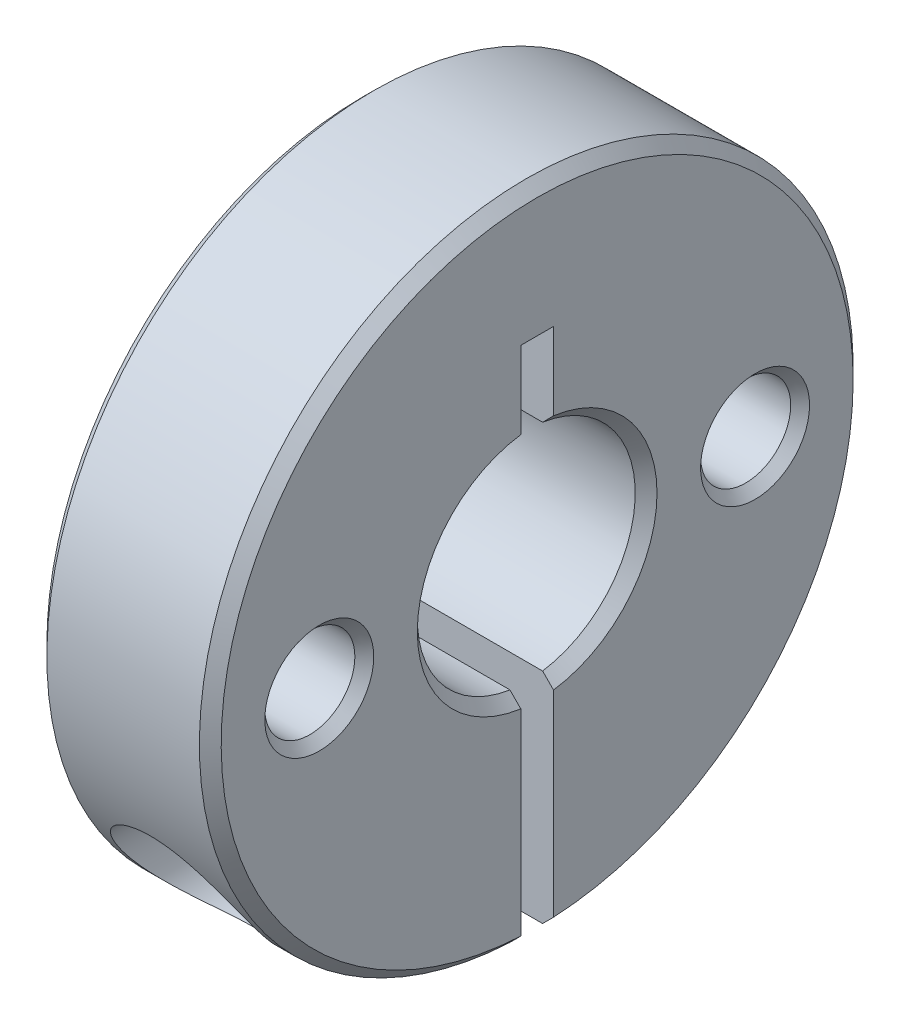
ISO-10303-21;
HEADER;
FILE_DESCRIPTION(('STEP AP214'),'2;1');
FILE_NAME('part.step','',(''),(''),'','','');
FILE_SCHEMA(('AUTOMOTIVE_DESIGN { 1 0 10303 214 1 1 1 1 }'));
ENDSEC;
DATA;
#1=APPLICATION_CONTEXT('core data for automotive mechanical design processes');
#2=APPLICATION_PROTOCOL_DEFINITION('international standard','automotive_design',2000,#1);
#3=PRODUCT_CONTEXT('',#1,'mechanical');
#4=PRODUCT('Part','Part','',(#3));
#5=PRODUCT_RELATED_PRODUCT_CATEGORY('part','',(#4));
#6=PRODUCT_DEFINITION_FORMATION('','',#4);
#7=PRODUCT_DEFINITION_CONTEXT('part definition',#1,'design');
#8=PRODUCT_DEFINITION('design','',#6,#7);
#9=PRODUCT_DEFINITION_SHAPE('','',#8);
#10=(LENGTH_UNIT() NAMED_UNIT(*) SI_UNIT(.MILLI.,.METRE.));
#11=(NAMED_UNIT(*) PLANE_ANGLE_UNIT() SI_UNIT($,.RADIAN.));
#12=(NAMED_UNIT(*) SI_UNIT($,.STERADIAN.) SOLID_ANGLE_UNIT());
#13=UNCERTAINTY_MEASURE_WITH_UNIT(LENGTH_MEASURE(1.E-05),#10,'distance_accuracy_value','');
#14=(GEOMETRIC_REPRESENTATION_CONTEXT(3) GLOBAL_UNCERTAINTY_ASSIGNED_CONTEXT((#13)) GLOBAL_UNIT_ASSIGNED_CONTEXT((#10,
#11,#12)) REPRESENTATION_CONTEXT('',''));
#15=CARTESIAN_POINT('',(0.,0.,0.));
#16=DIRECTION('',(0.,0.,1.));
#17=DIRECTION('',(1.,0.,0.));
#18=AXIS2_PLACEMENT_3D('',#15,#16,#17);
#19=CARTESIAN_POINT('',(3.567,0.,10.));
#20=DIRECTION('',(1.,0.,0.));
#21=DIRECTION('',(0.,0.,-1.));
#22=AXIS2_PLACEMENT_3D('',#19,#20,#21);
#23=CONICAL_SURFACE('',#22,2.067,0.785398163397448);
#24=CARTESIAN_POINT('',(3.567,0.,10.));
#25=DIRECTION('',(1.,0.,0.));
#26=DIRECTION('',(0.,0.,-1.));
#27=AXIS2_PLACEMENT_3D('',#24,#25,#26);
#28=CIRCLE('',#27,2.067);
#29=CARTESIAN_POINT('',(3.567,0.,7.933));
#30=VERTEX_POINT('',#29);
#31=EDGE_CURVE('E11',#30,#30,#28,.T.);
#32=ORIENTED_EDGE('',*,*,#31,.F.);
#33=EDGE_LOOP('',(#32));
#34=FACE_BOUND('',#33,.T.);
#35=CARTESIAN_POINT('',(4.,0.,10.));
#36=DIRECTION('',(1.,0.,0.));
#37=DIRECTION('',(0.,0.,-1.));
#38=AXIS2_PLACEMENT_3D('',#35,#36,#37);
#39=CIRCLE('',#38,2.5);
#40=CARTESIAN_POINT('',(4.,0.,7.5));
#41=VERTEX_POINT('',#40);
#42=EDGE_CURVE('E168',#41,#41,#39,.T.);
#43=ORIENTED_EDGE('',*,*,#42,.T.);
#44=EDGE_LOOP('',(#43));
#45=FACE_BOUND('',#44,.T.);
#46=ADVANCED_FACE('F17',(#34,#45),#23,.F.);
#47=CARTESIAN_POINT('',(4.,0.,10.));
#48=DIRECTION('',(1.,0.,0.));
#49=DIRECTION('',(0.,0.,-1.));
#50=AXIS2_PLACEMENT_3D('',#47,#48,#49);
#51=CYLINDRICAL_SURFACE('',#50,2.067);
#52=CARTESIAN_POINT('',(-3.567,0.,10.));
#53=DIRECTION('',(1.,0.,0.));
#54=DIRECTION('',(0.,0.,-1.));
#55=AXIS2_PLACEMENT_3D('',#52,#53,#54);
#56=CIRCLE('',#55,2.067);
#57=CARTESIAN_POINT('',(-3.567,0.,7.933));
#58=VERTEX_POINT('',#57);
#59=EDGE_CURVE('E28',#58,#58,#56,.T.);
#60=ORIENTED_EDGE('',*,*,#59,.F.);
#61=EDGE_LOOP('',(#60));
#62=FACE_BOUND('',#61,.T.);
#63=ORIENTED_EDGE('',*,*,#31,.T.);
#64=EDGE_LOOP('',(#63));
#65=FACE_BOUND('',#64,.T.);
#66=ADVANCED_FACE('F376',(#62,#65),#51,.F.);
#67=CARTESIAN_POINT('',(-4.,0.,10.));
#68=DIRECTION('',(-1.,0.,0.));
#69=DIRECTION('',(0.,0.,1.));
#70=AXIS2_PLACEMENT_3D('',#67,#68,#69);
#71=CONICAL_SURFACE('',#70,2.5,0.785398163397449);
#72=CARTESIAN_POINT('',(-4.,0.,10.));
#73=DIRECTION('',(1.,0.,0.));
#74=DIRECTION('',(0.,0.,-1.));
#75=AXIS2_PLACEMENT_3D('',#72,#73,#74);
#76=CIRCLE('',#75,2.5);
#77=CARTESIAN_POINT('',(-4.,0.,7.5));
#78=VERTEX_POINT('',#77);
#79=EDGE_CURVE('E222',#78,#78,#76,.T.);
#80=ORIENTED_EDGE('',*,*,#79,.F.);
#81=EDGE_LOOP('',(#80));
#82=FACE_BOUND('',#81,.T.);
#83=ORIENTED_EDGE('',*,*,#59,.T.);
#84=EDGE_LOOP('',(#83));
#85=FACE_BOUND('',#84,.T.);
#86=ADVANCED_FACE('F374',(#82,#85),#71,.F.);
#87=CARTESIAN_POINT('',(3.567,0.,-10.));
#88=DIRECTION('',(1.,0.,0.));
#89=DIRECTION('',(0.,0.,-1.));
#90=AXIS2_PLACEMENT_3D('',#87,#88,#89);
#91=CONICAL_SURFACE('',#90,2.067,0.785398163397448);
#92=CARTESIAN_POINT('',(3.567,0.,-10.));
#93=DIRECTION('',(1.,0.,0.));
#94=DIRECTION('',(0.,0.,-1.));
#95=AXIS2_PLACEMENT_3D('',#92,#93,#94);
#96=CIRCLE('',#95,2.067);
#97=CARTESIAN_POINT('',(3.567,0.,-12.067));
#98=VERTEX_POINT('',#97);
#99=EDGE_CURVE('E240',#98,#98,#96,.T.);
#100=ORIENTED_EDGE('',*,*,#99,.F.);
#101=EDGE_LOOP('',(#100));
#102=FACE_BOUND('',#101,.T.);
#103=CARTESIAN_POINT('',(4.,0.,-10.));
#104=DIRECTION('',(1.,0.,0.));
#105=DIRECTION('',(0.,0.,-1.));
#106=AXIS2_PLACEMENT_3D('',#103,#104,#105);
#107=CIRCLE('',#106,2.5);
#108=CARTESIAN_POINT('',(4.,0.,-12.5));
#109=VERTEX_POINT('',#108);
#110=EDGE_CURVE('E250',#109,#109,#107,.T.);
#111=ORIENTED_EDGE('',*,*,#110,.T.);
#112=EDGE_LOOP('',(#111));
#113=FACE_BOUND('',#112,.T.);
#114=ADVANCED_FACE('F372',(#102,#113),#91,.F.);
#115=CARTESIAN_POINT('',(4.,0.,-10.));
#116=DIRECTION('',(1.,0.,0.));
#117=DIRECTION('',(0.,0.,-1.));
#118=AXIS2_PLACEMENT_3D('',#115,#116,#117);
#119=CYLINDRICAL_SURFACE('',#118,2.067);
#120=CARTESIAN_POINT('',(-3.567,0.,-10.));
#121=DIRECTION('',(1.,0.,0.));
#122=DIRECTION('',(0.,0.,-1.));
#123=AXIS2_PLACEMENT_3D('',#120,#121,#122);
#124=CIRCLE('',#123,2.067);
#125=CARTESIAN_POINT('',(-3.567,0.,-12.067));
#126=VERTEX_POINT('',#125);
#127=EDGE_CURVE('E244',#126,#126,#124,.T.);
#128=ORIENTED_EDGE('',*,*,#127,.F.);
#129=EDGE_LOOP('',(#128));
#130=FACE_BOUND('',#129,.T.);
#131=ORIENTED_EDGE('',*,*,#99,.T.);
#132=EDGE_LOOP('',(#131));
#133=FACE_BOUND('',#132,.T.);
#134=ADVANCED_FACE('F368',(#130,#133),#119,.F.);
#135=CARTESIAN_POINT('',(-4.,0.,-10.));
#136=DIRECTION('',(-1.,0.,0.));
#137=DIRECTION('',(0.,0.,1.));
#138=AXIS2_PLACEMENT_3D('',#135,#136,#137);
#139=CONICAL_SURFACE('',#138,2.5,0.785398163397449);
#140=CARTESIAN_POINT('',(-4.,0.,-10.));
#141=DIRECTION('',(1.,0.,0.));
#142=DIRECTION('',(0.,0.,-1.));
#143=AXIS2_PLACEMENT_3D('',#140,#141,#142);
#144=CIRCLE('',#143,2.5);
#145=CARTESIAN_POINT('',(-4.,0.,-12.5));
#146=VERTEX_POINT('',#145);
#147=EDGE_CURVE('E204',#146,#146,#144,.T.);
#148=ORIENTED_EDGE('',*,*,#147,.F.);
#149=EDGE_LOOP('',(#148));
#150=FACE_BOUND('',#149,.T.);
#151=ORIENTED_EDGE('',*,*,#127,.T.);
#152=EDGE_LOOP('',(#151));
#153=FACE_BOUND('',#152,.T.);
#154=ADVANCED_FACE('F362',(#150,#153),#139,.F.);
#155=CARTESIAN_POINT('',(0.,-9.,-14.25));
#156=DIRECTION('',(0.,0.,-1.));
#157=DIRECTION('',(-1.,0.,0.));
#158=AXIS2_PLACEMENT_3D('',#155,#156,#157);
#159=CYLINDRICAL_SURFACE('',#158,1.2295);
#160=CARTESIAN_POINT('',(0.,-9.,-1.0205));
#161=DIRECTION('',(0.,0.,-1.));
#162=DIRECTION('',(-1.,0.,0.));
#163=AXIS2_PLACEMENT_3D('',#160,#161,#162);
#164=CIRCLE('',#163,1.2295);
#165=CARTESIAN_POINT('',(-1.2295,-9.,-1.0205));
#166=VERTEX_POINT('',#165);
#167=EDGE_CURVE('E330',#166,#166,#164,.T.);
#168=ORIENTED_EDGE('',*,*,#167,.F.);
#169=EDGE_LOOP('',(#168));
#170=FACE_BOUND('',#169,.T.);
#171=CARTESIAN_POINT('',(-1.2295,-9.,-12.));
#172=CARTESIAN_POINT('',(-1.22949903687024,-8.91650532521457,-12.062618271753));
#173=CARTESIAN_POINT('',(-1.22099819046928,-8.83223382257045,-12.1244488755977));
#174=CARTESIAN_POINT('',(-1.18600433099134,-8.66475536955165,-12.2446990213997));
#175=CARTESIAN_POINT('',(-1.15948740922647,-8.58154998367935,-12.3031139184379));
#176=CARTESIAN_POINT('',(-1.09547810250136,-8.43753619960128,-12.4021721293139));
#177=CARTESIAN_POINT('',(-1.06168617518575,-8.37582913513614,-12.4438970563747));
#178=CARTESIAN_POINT('',(-0.982388149361399,-8.2572615155196,-12.5228867860049));
#179=CARTESIAN_POINT('',(-0.936891984675387,-8.20039690460824,-12.5601553317706));
#180=CARTESIAN_POINT('',(-0.833948852790094,-8.09349521648211,-12.6293083377118));
#181=CARTESIAN_POINT('',(-0.776402373528062,-8.04352113170197,-12.6611436843852));
#182=CARTESIAN_POINT('',(-0.650644983572041,-7.95392627721546,-12.7176205967301));
#183=CARTESIAN_POINT('',(-0.582444304408762,-7.91429567089304,-12.7422689997964));
#184=CARTESIAN_POINT('',(-0.44836979707426,-7.85316310736465,-12.7800207428912));
#185=CARTESIAN_POINT('',(-0.383653677975963,-7.82984324950397,-12.794294799492));
#186=CARTESIAN_POINT('',(-0.250172728815347,-7.79424742731836,-12.8160115352396));
#187=CARTESIAN_POINT('',(-0.18141185035928,-7.78196086863777,-12.8234607678343));
#188=CARTESIAN_POINT('',(-0.0509422249437208,-7.77002704223174,-12.8306943393349));
#189=CARTESIAN_POINT('',(0.0106007014016626,-7.76901794052606,-12.8313045666463));
#190=CARTESIAN_POINT('',(0.132941521525758,-7.77617521729976,-12.8269683625141));
#191=CARTESIAN_POINT('',(0.193739620506211,-7.78433900841663,-12.8220234979738));
#192=CARTESIAN_POINT('',(0.310872109045502,-7.8089928381838,-12.8070225725604));
#193=CARTESIAN_POINT('',(0.367287160147323,-7.8252068203924,-12.7971359044097));
#194=CARTESIAN_POINT('',(0.476350145090983,-7.86504057431043,-12.7726927359963));
#195=CARTESIAN_POINT('',(0.528997585108792,-7.88866131465439,-12.7581356249407));
#196=CARTESIAN_POINT('',(0.632016278504355,-7.94368181402839,-12.7239544224354));
#197=CARTESIAN_POINT('',(0.682133952078699,-7.97541725721484,-12.7041095166873));
#198=CARTESIAN_POINT('',(0.77618621627973,-8.04468797543866,-12.6603583140388));
#199=CARTESIAN_POINT('',(0.820118503035924,-8.0822254006764,-12.6364505111105));
#200=CARTESIAN_POINT('',(0.906018140401137,-8.16643904733157,-12.5822118634741));
#201=CARTESIAN_POINT('',(0.94717256610695,-8.2136700374815,-12.5514581004158));
#202=CARTESIAN_POINT('',(1.02096061781423,-8.3121750261861,-12.4864420698837));
#203=CARTESIAN_POINT('',(1.05358975380153,-8.36345113675074,-12.4521779667903));
#204=CARTESIAN_POINT('',(1.11488801883043,-8.47703390535586,-12.3751892302271));
#205=CARTESIAN_POINT('',(1.14210432004452,-8.5397987379352,-12.3319853130481));
#206=CARTESIAN_POINT('',(1.18549790807839,-8.66713829199465,-12.242825328428));
#207=CARTESIAN_POINT('',(1.20166930254605,-8.73171396044476,-12.1968678061625));
#208=CARTESIAN_POINT('',(1.22527442376572,-8.87236794509615,-12.0950337681932));
#209=CARTESIAN_POINT('',(1.23073952166908,-8.94852375482987,-12.0388056073471));
#210=CARTESIAN_POINT('',(1.22778928932068,-9.09961250437411,-11.9250166589663));
#211=CARTESIAN_POINT('',(1.21936047327974,-9.17454418470465,-11.8674546302239));
#212=CARTESIAN_POINT('',(1.18709208393158,-9.33118596184038,-11.7447899713193));
#213=CARTESIAN_POINT('',(1.16139294421812,-9.41251223751991,-11.6796790839334));
#214=CARTESIAN_POINT('',(1.09303019751645,-9.56945380353177,-11.551441535557));
#215=CARTESIAN_POINT('',(1.05037362113126,-9.64507144523952,-11.488314063926));
#216=CARTESIAN_POINT('',(0.959680542589986,-9.77153465014391,-11.3807886348741));
#217=CARTESIAN_POINT('',(0.91514483731411,-9.82407485819922,-11.3354251731674));
#218=CARTESIAN_POINT('',(0.815657670420337,-9.92263740225646,-11.2492456232473));
#219=CARTESIAN_POINT('',(0.760722905205075,-9.96866998253857,-11.2084224099016));
#220=CARTESIAN_POINT('',(0.654509779243567,-10.0423218070898,-11.1424247581654));
#221=CARTESIAN_POINT('',(0.605366290588804,-10.0717316767444,-11.1158210940528));
#222=CARTESIAN_POINT('',(0.501320158078037,-10.124156784142,-11.0680940085103));
#223=CARTESIAN_POINT('',(0.446424810136305,-10.1471799909114,-11.0469637597694));
#224=CARTESIAN_POINT('',(0.340725129856197,-10.1824473144091,-11.0144565953094));
#225=CARTESIAN_POINT('',(0.290606017701628,-10.1958091890354,-11.002075451562));
#226=CARTESIAN_POINT('',(0.188014455810648,-10.2161616751429,-10.9831797312959));
#227=CARTESIAN_POINT('',(0.135543500402809,-10.2231562737405,-10.9766614835285));
#228=CARTESIAN_POINT('',(0.0295713951120025,-10.2302939681324,-10.9700096357148));
#229=CARTESIAN_POINT('',(-0.0239322998106492,-10.2304171475501,-10.9698945949636));
#230=CARTESIAN_POINT('',(-0.130125610278265,-10.2237521947992,-10.9761063302888));
#231=CARTESIAN_POINT('',(-0.182815091231471,-10.2169629321335,-10.9824341600661));
#232=CARTESIAN_POINT('',(-0.283683036507581,-10.1973827390797,-11.0006159376238));
#233=CARTESIAN_POINT('',(-0.331958007643797,-10.184855021586,-11.0122273943435));
#234=CARTESIAN_POINT('',(-0.425408108859989,-10.1546059353925,-11.0401268559154));
#235=CARTESIAN_POINT('',(-0.470581869077565,-10.1368822895417,-11.0564169111314));
#236=CARTESIAN_POINT('',(-0.574423939622663,-10.0891003958,-11.1000659454654));
#237=CARTESIAN_POINT('',(-0.631357033987356,-10.0569366222527,-11.1292540804374));
#238=CARTESIAN_POINT('',(-0.737447784552465,-9.98586890768674,-11.1930653896078));
#239=CARTESIAN_POINT('',(-0.786589450970131,-9.94695144058999,-11.2276994574155));
#240=CARTESIAN_POINT('',(-0.891036737676859,-9.85099566066572,-11.3120781205852));
#241=CARTESIAN_POINT('',(-0.943521701200818,-9.79208207488264,-11.3631762947657));
#242=CARTESIAN_POINT('',(-1.03526798929581,-9.66773722675456,-11.4691567624378));
#243=CARTESIAN_POINT('',(-1.07451181950233,-9.60229748862503,-11.5240439476525));
#244=CARTESIAN_POINT('',(-1.14056712275481,-9.46546099453245,-11.6367114213212));
#245=CARTESIAN_POINT('',(-1.16713564480756,-9.39397655251296,-11.6945264172413));
#246=CARTESIAN_POINT('',(-1.2066362271238,-9.24780859282567,-11.8104485190191));
#247=CARTESIAN_POINT('',(-1.21960202229528,-9.17313346954843,-11.8685545414321));
#248=CARTESIAN_POINT('',(-1.22819901801466,-9.06523074882488,-11.950869222201));
#249=CARTESIAN_POINT('',(-1.22950037691181,-9.03267485903174,-11.975494925783));
#250=CARTESIAN_POINT('',(-1.2295,-9.,-12.));
#251=B_SPLINE_CURVE_WITH_KNOTS('',3,(#171,#172,#173,#174,#175,#176,#177,#178,#179,#180,#181,
#182,#183,#184,#185,#186,#187,#188,#189,#190,#191,#192,#193,#194,#195,#196,#197,#198,#199,#200,
#201,#202,#203,#204,#205,#206,#207,#208,#209,#210,#211,#212,#213,#214,#215,#216,#217,#218,#219,
#220,#221,#222,#223,#224,#225,#226,#227,#228,#229,#230,#231,#232,#233,#234,#235,#236,#237,#238,
#239,#240,#241,#242,#243,#244,#245,#246,#247,#248,#249,#250),.UNSPECIFIED.,.T.,.F.,(4,2,2,2,2,2,
2,2,2,2,2,2,2,2,2,2,2,2,2,2,2,2,2,2,2,2,2,2,2,2,2,2,2,2,2,2,2,2,2,4),(0.,0.312977816645716,
0.626371791781494,0.870785370583508,1.11499218694933,1.36130136988563,1.60737545294663,
1.81691758276531,2.02625829096273,2.21000049138097,2.39369087735298,2.57147708456851,
2.74928655185674,2.93617727831033,3.12313743281571,3.33169005112327,3.54035228743186,
3.78216691666489,4.02411045113288,4.30745379507872,4.59107232131544,4.91153154184312,
5.23185803737429,5.4784213197104,5.72459203489745,5.91335495448983,6.10188127272933,
6.26117920367922,6.42037731530846,6.58003682875482,6.73972245795633,6.89272154356409,
7.04578778255435,7.25943450550826,7.47351415819645,7.75403744143886,8.03492991765988,
8.32100921691981,8.60637734713558,8.72885828457552),.UNSPECIFIED.);
#252=CARTESIAN_POINT('',(-1.2295,-9.,-12.));
#253=VERTEX_POINT('',#252);
#254=EDGE_CURVE('E340',#253,#253,#251,.F.);
#255=ORIENTED_EDGE('',*,*,#254,.F.);
#256=EDGE_LOOP('',(#255));
#257=FACE_BOUND('',#256,.T.);
#258=ADVANCED_FACE('F356',(#170,#257),#159,.F.);
#259=CARTESIAN_POINT('',(0.,-9.,-0.75));
#260=DIRECTION('',(0.,0.,1.));
#261=DIRECTION('',(1.,0.,0.));
#262=AXIS2_PLACEMENT_3D('',#259,#260,#261);
#263=CONICAL_SURFACE('',#262,1.5,0.785398163397456);
#264=CARTESIAN_POINT('',(0.,-9.,-0.75));
#265=DIRECTION('',(0.,0.,-1.));
#266=DIRECTION('',(-1.,0.,0.));
#267=AXIS2_PLACEMENT_3D('',#264,#265,#266);
#268=CIRCLE('',#267,1.5);
#269=CARTESIAN_POINT('',(-1.5,-9.,-0.75));
#270=VERTEX_POINT('',#269);
#271=EDGE_CURVE('E310',#270,#270,#268,.T.);
#272=ORIENTED_EDGE('',*,*,#271,.F.);
#273=EDGE_LOOP('',(#272));
#274=FACE_BOUND('',#273,.T.);
#275=ORIENTED_EDGE('',*,*,#167,.T.);
#276=EDGE_LOOP('',(#275));
#277=FACE_BOUND('',#276,.T.);
#278=ADVANCED_FACE('F361',(#274,#277),#263,.F.);
#279=CARTESIAN_POINT('',(0.,-9.,15.));
#280=DIRECTION('',(0.,0.,1.));
#281=DIRECTION('',(1.,0.,0.));
#282=AXIS2_PLACEMENT_3D('',#279,#280,#281);
#283=CYLINDRICAL_SURFACE('',#282,3.);
#284=CARTESIAN_POINT('',(0.,-9.,5.));
#285=DIRECTION('',(0.,0.,1.));
#286=DIRECTION('',(1.,0.,0.));
#287=AXIS2_PLACEMENT_3D('',#284,#285,#286);
#288=CIRCLE('',#287,3.);
#289=CARTESIAN_POINT('',(3.,-9.,5.));
#290=VERTEX_POINT('',#289);
#291=EDGE_CURVE('E326',#290,#290,#288,.T.);
#292=ORIENTED_EDGE('',*,*,#291,.F.);
#293=EDGE_LOOP('',(#292));
#294=FACE_BOUND('',#293,.T.);
#295=CARTESIAN_POINT('',(3.,-9.,12.));
#296=CARTESIAN_POINT('',(3.0000000281716,-8.89761236658478,12.0767910518407));
#297=CARTESIAN_POINT('',(2.99475925357747,-8.79423482665152,12.1522714865818));
#298=CARTESIAN_POINT('',(2.97318304015255,-8.58635837613578,12.3000286081194));
#299=CARTESIAN_POINT('',(2.95684959366341,-8.48185967024123,12.3723058677516));
#300=CARTESIAN_POINT('',(2.91248078357458,-8.27276451387101,12.5130827860168));
#301=CARTESIAN_POINT('',(2.88444539051334,-8.16816806314991,12.5815824351385));
#302=CARTESIAN_POINT('',(2.81618127232349,-7.9602401958805,12.7141572656467));
#303=CARTESIAN_POINT('',(2.77595868565652,-7.85690816966203,12.7782346545404));
#304=CARTESIAN_POINT('',(2.66283888793594,-7.6089681862633,12.9279752502093));
#305=CARTESIAN_POINT('',(2.58332928100595,-7.46573091706655,13.0110631195871));
#306=CARTESIAN_POINT('',(2.39832368976567,-7.19014981059152,13.1653606242811));
#307=CARTESIAN_POINT('',(2.2928493967507,-7.05779700276993,13.2365800917805));
#308=CARTESIAN_POINT('',(2.05646546874585,-6.80898865451281,13.3662817162172));
#309=CARTESIAN_POINT('',(1.92542233820795,-6.69262226292782,13.4246934482085));
#310=CARTESIAN_POINT('',(1.64132842921988,-6.48261981755891,13.5273564939002));
#311=CARTESIAN_POINT('',(1.48828332953237,-6.38897791524079,13.5716114520222));
#312=CARTESIAN_POINT('',(1.1804951889875,-6.23720512454645,13.641980090626));
#313=CARTESIAN_POINT('',(1.02729950903098,-6.17654303486977,13.6694193149134));
#314=CARTESIAN_POINT('',(0.711495833980856,-6.08093219126733,13.7122223655172));
#315=CARTESIAN_POINT('',(0.548891532383554,-6.04597342000354,13.7275908962969));
#316=CARTESIAN_POINT('',(0.228738324941823,-6.00462525829323,13.7457247749398));
#317=CARTESIAN_POINT('',(0.071417333071448,-5.99674357475033,13.7491486050878));
#318=CARTESIAN_POINT('',(-0.242372321077991,-6.00569238676457,13.7452422965788));
#319=CARTESIAN_POINT('',(-0.398841113122292,-6.02251900801852,13.7379138438977));
#320=CARTESIAN_POINT('',(-0.704187401497253,-6.07974135372398,13.712683506812));
#321=CARTESIAN_POINT('',(-0.853141164816375,-6.11979884383196,13.6949333146547));
#322=CARTESIAN_POINT('',(-1.14174190334556,-6.22154040079625,13.6490120061103));
#323=CARTESIAN_POINT('',(-1.28138886403182,-6.28322450140118,13.6208408734614));
#324=CARTESIAN_POINT('',(-1.55003715631045,-6.42687636769338,13.553657034606));
#325=CARTESIAN_POINT('',(-1.67882679018881,-6.50915965499257,13.5144743967473));
#326=CARTESIAN_POINT('',(-1.92025669383705,-6.69015309415317,13.4257955162727));
#327=CARTESIAN_POINT('',(-2.03289450924844,-6.78886573763276,13.3762977090073));
#328=CARTESIAN_POINT('',(-2.24549454768574,-7.00453865254523,13.2646863141449));
#329=CARTESIAN_POINT('',(-2.34448350129256,-7.12218399128979,13.2020476318901));
#330=CARTESIAN_POINT('',(-2.52129418068924,-7.36723093319321,13.0668856385658));
#331=CARTESIAN_POINT('',(-2.59910912395928,-7.49463564579472,12.9943591713531));
#332=CARTESIAN_POINT('',(-2.74028616851803,-7.76838108440307,12.8327689166305));
#333=CARTESIAN_POINT('',(-2.80138831560887,-7.91533323887633,12.7427743038199));
#334=CARTESIAN_POINT('',(-2.89877473455527,-8.21166349041424,12.5538653262507));
#335=CARTESIAN_POINT('',(-2.93504448891103,-8.3610429543841,12.4549457819801));
#336=CARTESIAN_POINT('',(-2.98815299574943,-8.68173282264211,12.2340104619415));
#337=CARTESIAN_POINT('',(-3.00110724575922,-8.85285263476353,12.1107916373077));
#338=CARTESIAN_POINT('',(-2.99874327147509,-9.18950076395348,11.8573848450307));
#339=CARTESIAN_POINT('',(-2.98341811038934,-9.35502769897621,11.7271951750819));
#340=CARTESIAN_POINT('',(-2.92175090623679,-9.70794937361779,11.4375281038091));
#341=CARTESIAN_POINT('',(-2.87015346525393,-9.89365907750904,11.2771197227891));
#342=CARTESIAN_POINT('',(-2.73356234999849,-10.2507218337155,10.9535779263071));
#343=CARTESIAN_POINT('',(-2.64848379387107,-10.4220370426764,10.7904386017843));
#344=CARTESIAN_POINT('',(-2.4894845516896,-10.6776384099444,10.5359099526734));
#345=CARTESIAN_POINT('',(-2.42630471695768,-10.7678570129837,10.4436206890144));
#346=CARTESIAN_POINT('',(-2.2892490918834,-10.9420691702141,10.2609465629855));
#347=CARTESIAN_POINT('',(-2.21536816930779,-11.0260597080397,10.1705626383776));
#348=CARTESIAN_POINT('',(-2.05687652730042,-11.1867689568341,9.99352035195065));
#349=CARTESIAN_POINT('',(-1.97230198571086,-11.2635107291835,9.90685068983362));
#350=CARTESIAN_POINT('',(-1.79173671957351,-11.4089632039896,9.73898667649849));
#351=CARTESIAN_POINT('',(-1.69575961544526,-11.4776832975822,9.6577859707717));
#352=CARTESIAN_POINT('',(-1.49584349460759,-11.6030346161821,9.50677710957465));
#353=CARTESIAN_POINT('',(-1.3924030940932,-11.6600503351405,9.4366351675753));
#354=CARTESIAN_POINT('',(-1.17390349564229,-11.7634236987022,9.30745361292691));
#355=CARTESIAN_POINT('',(-1.05886187343007,-11.8097971272126,9.24839758241525));
#356=CARTESIAN_POINT('',(-0.837823280746388,-11.8825701473084,9.15464132366608));
#357=CARTESIAN_POINT('',(-0.733550427058158,-11.9110160070761,9.11751662450088));
#358=CARTESIAN_POINT('',(-0.51867475810223,-11.956856875139,9.05731883687037));
#359=CARTESIAN_POINT('',(-0.408078745744484,-11.9742635250906,9.03423094662695));
#360=CARTESIAN_POINT('',(-0.1825602661193,-11.9965945264265,9.00455960786743));
#361=CARTESIAN_POINT('',(-0.0676126349161518,-12.0014292778362,8.99809463457973));
#362=CARTESIAN_POINT('',(0.161700447047636,-11.9978329671069,9.00288899682817));
#363=CARTESIAN_POINT('',(0.276065873499413,-11.9894013555402,9.01414906644861));
#364=CARTESIAN_POINT('',(0.488134144694279,-11.9617445688353,9.05080662759414));
#365=CARTESIAN_POINT('',(0.586304285380237,-11.9437807771749,9.07454944413839));
#366=CARTESIAN_POINT('',(0.777256836163909,-11.8992236793557,9.13289789189033));
#367=CARTESIAN_POINT('',(0.870036794352186,-11.8726264816761,9.16750842150605));
#368=CARTESIAN_POINT('',(1.10008967509261,-11.7949548688011,9.26741303177506));
#369=CARTESIAN_POINT('',(1.23282126111613,-11.7385470820405,9.33898606754431));
#370=CARTESIAN_POINT('',(1.48257695471508,-11.6118373037573,9.49607563012608));
#371=CARTESIAN_POINT('',(1.59955279776914,-11.5414941804126,9.58163330026485));
#372=CARTESIAN_POINT('',(1.79168251725764,-11.4083135896568,9.73952405581402));
#373=CARTESIAN_POINT('',(1.870073723331,-11.3478378809344,9.8099846574017));
#374=CARTESIAN_POINT('',(2.01873568555686,-11.2213153656014,9.95446124256341));
#375=CARTESIAN_POINT('',(2.08900228233066,-11.1552657351001,10.0284790200188));
#376=CARTESIAN_POINT('',(2.22177455277774,-11.0181265402706,10.1789620606932));
#377=CARTESIAN_POINT('',(2.28427106615439,-10.9470311796041,10.2554300815066));
#378=CARTESIAN_POINT('',(2.40160294254063,-10.8003125162991,10.4098316436995));
#379=CARTESIAN_POINT('',(2.45643961675277,-10.7246899917893,10.4877649316585));
#380=CARTESIAN_POINT('',(2.56052530353253,-10.5662180534314,10.647448621986));
#381=CARTESIAN_POINT('',(2.60947437027293,-10.4832020001452,10.7292296702897));
#382=CARTESIAN_POINT('',(2.6991386785255,-10.3129788782135,10.8929547918378));
#383=CARTESIAN_POINT('',(2.73985061527458,-10.2257701447489,10.9748989172473));
#384=CARTESIAN_POINT('',(2.84914258768015,-9.95879124590553,11.2196420083053));
#385=CARTESIAN_POINT('',(2.90524738012766,-9.77310620844951,11.3819222604959));
#386=CARTESIAN_POINT('',(2.96172760108871,-9.48723477105997,11.6192734996374));
#387=CARTESIAN_POINT('',(2.97593482707689,-9.39154113851759,11.6967624917702));
#388=CARTESIAN_POINT('',(2.99507673555968,-9.197543690363,11.8499129665532));
#389=CARTESIAN_POINT('',(2.99999997269534,-9.0992368042459,11.9255720800924));
#390=CARTESIAN_POINT('',(3.,-9.,12.));
#391=B_SPLINE_CURVE_WITH_KNOTS('',3,(#295,#296,#297,#298,#299,#300,#301,#302,#303,#304,#305,
#306,#307,#308,#309,#310,#311,#312,#313,#314,#315,#316,#317,#318,#319,#320,#321,#322,#323,#324,
#325,#326,#327,#328,#329,#330,#331,#332,#333,#334,#335,#336,#337,#338,#339,#340,#341,#342,#343,
#344,#345,#346,#347,#348,#349,#350,#351,#352,#353,#354,#355,#356,#357,#358,#359,#360,#361,#362,
#363,#364,#365,#366,#367,#368,#369,#370,#371,#372,#373,#374,#375,#376,#377,#378,#379,#380,#381,
#382,#383,#384,#385,#386,#387,#388,#389,#390),.UNSPECIFIED.,.T.,.F.,(4,2,2,2,2,2,2,2,2,2,2,2,2,
2,2,2,2,2,2,2,2,2,2,2,2,2,2,2,2,2,2,2,2,2,2,2,2,2,2,2,2,2,2,2,2,2,2,4),(0.,0.383830399082823,
0.767591877068661,1.15135432124226,1.53492379186393,2.083534837616,2.63168911149913,
3.18278583058226,3.73374056476171,4.23226829983649,4.73060164087571,5.20098710607217,
5.6712988219229,6.13492897904277,6.59855985966696,7.06978057907242,7.54107282737556,
8.03705678431843,8.53319942973885,9.07955810931599,9.62623592868674,10.2576722683464,
10.8892635166315,11.638741228116,12.3901313964943,12.8207638220334,13.2516034666368,
13.6810226866713,14.1099340252435,14.5209675303584,14.9313874215148,15.2729027611168,
15.614057346228,15.9576367602748,16.3012304040691,16.6077886058588,16.9144851815557,
17.3947808246957,17.8765158269225,18.2406143106474,18.6048983762483,18.9696079108855,
19.3342549382512,19.7130721659788,20.0920410763345,20.8473568739945,21.218917692021,
21.5909362738251),.UNSPECIFIED.);
#392=CARTESIAN_POINT('',(3.,-9.,12.));
#393=VERTEX_POINT('',#392);
#394=EDGE_CURVE('E179',#393,#393,#391,.F.);
#395=ORIENTED_EDGE('',*,*,#394,.F.);
#396=EDGE_LOOP('',(#395));
#397=FACE_BOUND('',#396,.T.);
#398=ADVANCED_FACE('F694',(#294,#397),#283,.F.);
#399=CARTESIAN_POINT('',(0.,-10.7,5.));
#400=DIRECTION('',(0.,0.,1.));
#401=DIRECTION('',(1.,0.,0.));
#402=AXIS2_PLACEMENT_3D('',#399,#400,#401);
#403=PLANE('',#402);
#404=CARTESIAN_POINT('',(0.,-9.,5.));
#405=DIRECTION('',(0.,0.,1.));
#406=DIRECTION('',(1.,0.,0.));
#407=AXIS2_PLACEMENT_3D('',#404,#405,#406);
#408=CIRCLE('',#407,1.7);
#409=CARTESIAN_POINT('',(1.7,-9.,5.));
#410=VERTEX_POINT('',#409);
#411=EDGE_CURVE('E322',#410,#410,#408,.T.);
#412=ORIENTED_EDGE('',*,*,#411,.F.);
#413=EDGE_LOOP('',(#412));
#414=FACE_BOUND('',#413,.T.);
#415=ORIENTED_EDGE('',*,*,#291,.T.);
#416=EDGE_LOOP('',(#415));
#417=FACE_BOUND('',#416,.T.);
#418=ADVANCED_FACE('F423',(#414,#417),#403,.T.);
#419=CARTESIAN_POINT('',(0.,-9.,15.));
#420=DIRECTION('',(0.,0.,1.));
#421=DIRECTION('',(1.,0.,0.));
#422=AXIS2_PLACEMENT_3D('',#419,#420,#421);
#423=CYLINDRICAL_SURFACE('',#422,1.7);
#424=CARTESIAN_POINT('',(0.,-9.,0.75));
#425=DIRECTION('',(0.,0.,1.));
#426=DIRECTION('',(-1.,0.,0.));
#427=AXIS2_PLACEMENT_3D('',#424,#425,#426);
#428=CIRCLE('',#427,1.7);
#429=CARTESIAN_POINT('',(-1.7,-9.,0.75));
#430=VERTEX_POINT('',#429);
#431=EDGE_CURVE('E314',#430,#430,#428,.T.);
#432=ORIENTED_EDGE('',*,*,#431,.F.);
#433=EDGE_LOOP('',(#432));
#434=FACE_BOUND('',#433,.T.);
#435=ORIENTED_EDGE('',*,*,#411,.T.);
#436=EDGE_LOOP('',(#435));
#437=FACE_BOUND('',#436,.T.);
#438=ADVANCED_FACE('F364',(#434,#437),#423,.F.);
#439=CARTESIAN_POINT('',(4.,9.,-0.75));
#440=DIRECTION('',(0.,-1.,0.));
#441=DIRECTION('',(0.,0.,-1.));
#442=AXIS2_PLACEMENT_3D('',#439,#440,#441);
#443=PLANE('',#442);
#444=DIRECTION('',(0.,0.,1.));
#445=VECTOR('',#444,1.);
#446=CARTESIAN_POINT('',(-4.,9.,-0.75));
#447=LINE('',#446,#445);
#448=CARTESIAN_POINT('',(-4.,9.,-0.75));
#449=VERTEX_POINT('',#448);
#450=CARTESIAN_POINT('',(-4.,9.,0.75));
#451=VERTEX_POINT('',#450);
#452=EDGE_CURVE('E194',#449,#451,#447,.T.);
#453=ORIENTED_EDGE('',*,*,#452,.F.);
#454=DIRECTION('',(-1.,0.,0.));
#455=VECTOR('',#454,1.);
#456=CARTESIAN_POINT('',(4.,9.,-0.75));
#457=LINE('',#456,#455);
#458=CARTESIAN_POINT('',(4.,9.,-0.75));
#459=VERTEX_POINT('',#458);
#460=EDGE_CURVE('E41',#459,#449,#457,.T.);
#461=ORIENTED_EDGE('',*,*,#460,.F.);
#462=DIRECTION('',(0.,0.,1.));
#463=VECTOR('',#462,1.);
#464=CARTESIAN_POINT('',(4.,9.,-0.75));
#465=LINE('',#464,#463);
#466=CARTESIAN_POINT('',(4.,9.,0.75));
#467=VERTEX_POINT('',#466);
#468=EDGE_CURVE('E213',#459,#467,#465,.T.);
#469=ORIENTED_EDGE('',*,*,#468,.T.);
#470=DIRECTION('',(-1.,0.,0.));
#471=VECTOR('',#470,1.);
#472=CARTESIAN_POINT('',(4.,9.,0.75));
#473=LINE('',#472,#471);
#474=EDGE_CURVE('E51',#467,#451,#473,.T.);
#475=ORIENTED_EDGE('',*,*,#474,.T.);
#476=EDGE_LOOP('',(#453,#461,#469,#475));
#477=FACE_BOUND('',#476,.T.);
#478=ADVANCED_FACE('F412',(#477),#443,.T.);
#479=CARTESIAN_POINT('',(4.,9.,0.75));
#480=DIRECTION('',(0.,0.,-1.));
#481=DIRECTION('',(0.,-1.,0.));
#482=AXIS2_PLACEMENT_3D('',#479,#480,#481);
#483=PLANE('',#482);
#484=DIRECTION('',(0.,-1.,0.));
#485=VECTOR('',#484,1.);
#486=CARTESIAN_POINT('',(-4.,9.,0.75));
#487=LINE('',#486,#485);
#488=CARTESIAN_POINT('',(-4.,5.44862367942584,0.75));
#489=VERTEX_POINT('',#488);
#490=EDGE_CURVE('E198',#451,#489,#487,.T.);
#491=ORIENTED_EDGE('',*,*,#490,.F.);
#492=ORIENTED_EDGE('',*,*,#474,.F.);
#493=DIRECTION('',(0.,-1.,0.));
#494=VECTOR('',#493,1.);
#495=CARTESIAN_POINT('',(4.,9.,0.75));
#496=LINE('',#495,#494);
#497=CARTESIAN_POINT('',(4.,5.44862367942584,0.75));
#498=VERTEX_POINT('',#497);
#499=EDGE_CURVE('E210',#467,#498,#496,.T.);
#500=ORIENTED_EDGE('',*,*,#499,.T.);
#501=CARTESIAN_POINT('',(3.5,4.9434299833213,0.75));
#502=CARTESIAN_POINT('',(3.66657819671435,5.11191441344003,0.75));
#503=CARTESIAN_POINT('',(3.83325298492479,5.28030436855534,0.75));
#504=CARTESIAN_POINT('',(4.,5.44862367942584,0.75));
#505=B_SPLINE_CURVE_WITH_KNOTS('',3,(#501,#502,#503,#504),.UNSPECIFIED.,.F.,.F.,(4,4),
(0.0138521254088545,0.0145618807638747),.UNSPECIFIED.);
#506=CARTESIAN_POINT('',(3.5,4.9434299833213,0.75));
#507=VERTEX_POINT('',#506);
#508=EDGE_CURVE('E297',#507,#498,#505,.T.);
#509=ORIENTED_EDGE('',*,*,#508,.F.);
#510=DIRECTION('',(1.,0.,0.));
#511=VECTOR('',#510,1.);
#512=CARTESIAN_POINT('',(4.,4.9434299833213,0.75));
#513=LINE('',#512,#511);
#514=CARTESIAN_POINT('',(-3.5,4.9434299833213,0.75));
#515=VERTEX_POINT('',#514);
#516=EDGE_CURVE('E267',#515,#507,#513,.T.);
#517=ORIENTED_EDGE('',*,*,#516,.F.);
#518=CARTESIAN_POINT('',(-4.,5.44862367942584,0.75));
#519=CARTESIAN_POINT('',(-3.83325164976726,5.2803030208083,0.75));
#520=CARTESIAN_POINT('',(-3.6665767281134,5.11191292803318,0.75));
#521=CARTESIAN_POINT('',(-3.5,4.9434299833213,0.75));
#522=B_SPLINE_CURVE_WITH_KNOTS('',3,(#518,#519,#520,#521),.UNSPECIFIED.,.F.,.F.,(4,4),
(9.94358004317836E-07,0.000711598615025338),.UNSPECIFIED.);
#523=EDGE_CURVE('E239',#489,#515,#522,.T.);
#524=ORIENTED_EDGE('',*,*,#523,.F.);
#525=EDGE_LOOP('',(#491,#492,#500,#509,#517,#524));
#526=FACE_BOUND('',#525,.T.);
#527=ADVANCED_FACE('F408',(#526),#483,.T.);
#528=CARTESIAN_POINT('',(4.,-15.,-0.75));
#529=DIRECTION('',(0.,0.,1.));
#530=DIRECTION('',(1.,0.,0.));
#531=AXIS2_PLACEMENT_3D('',#528,#529,#530);
#532=PLANE('',#531);
#533=DIRECTION('',(-1.,0.,0.));
#534=VECTOR('',#533,1.);
#535=CARTESIAN_POINT('',(4.,4.9434299833213,-0.75));
#536=LINE('',#535,#534);
#537=CARTESIAN_POINT('',(3.5,4.9434299833213,-0.75));
#538=VERTEX_POINT('',#537);
#539=CARTESIAN_POINT('',(-3.5,4.9434299833213,-0.75));
#540=VERTEX_POINT('',#539);
#541=EDGE_CURVE('E284',#538,#540,#536,.T.);
#542=ORIENTED_EDGE('',*,*,#541,.F.);
#543=CARTESIAN_POINT('',(4.,5.44862367942584,-0.75));
#544=CARTESIAN_POINT('',(3.83325164976726,5.2803030208083,-0.75));
#545=CARTESIAN_POINT('',(3.6665767281134,5.11191292803318,-0.75));
#546=CARTESIAN_POINT('',(3.5,4.9434299833213,-0.75));
#547=B_SPLINE_CURVE_WITH_KNOTS('',3,(#543,#544,#545,#546),.UNSPECIFIED.,.F.,.F.,(4,4),
(9.94358004317836E-07,0.000711598615025338),.UNSPECIFIED.);
#548=CARTESIAN_POINT('',(4.,5.44862367942584,-0.75));
#549=VERTEX_POINT('',#548);
#550=EDGE_CURVE('E296',#549,#538,#547,.T.);
#551=ORIENTED_EDGE('',*,*,#550,.F.);
#552=DIRECTION('',(0.,1.,0.));
#553=VECTOR('',#552,1.);
#554=CARTESIAN_POINT('',(4.,-15.,-0.75));
#555=LINE('',#554,#553);
#556=EDGE_CURVE('E274',#549,#459,#555,.T.);
#557=ORIENTED_EDGE('',*,*,#556,.T.);
#558=ORIENTED_EDGE('',*,*,#460,.T.);
#559=DIRECTION('',(0.,1.,0.));
#560=VECTOR('',#559,1.);
#561=CARTESIAN_POINT('',(-4.,-15.,-0.75));
#562=LINE('',#561,#560);
#563=CARTESIAN_POINT('',(-4.,5.44862367942584,-0.75));
#564=VERTEX_POINT('',#563);
#565=EDGE_CURVE('E199',#564,#449,#562,.T.);
#566=ORIENTED_EDGE('',*,*,#565,.F.);
#567=CARTESIAN_POINT('',(-3.5,4.9434299833213,-0.75));
#568=CARTESIAN_POINT('',(-3.66657819671435,5.11191441344003,-0.75));
#569=CARTESIAN_POINT('',(-3.83325298492478,5.28030436855533,-0.75));
#570=CARTESIAN_POINT('',(-4.,5.44862367942584,-0.75));
#571=B_SPLINE_CURVE_WITH_KNOTS('',3,(#567,#568,#569,#570),.UNSPECIFIED.,.F.,.F.,(4,4),
(0.0138521254088545,0.0145618807638747),.UNSPECIFIED.);
#572=EDGE_CURVE('E265',#540,#564,#571,.T.);
#573=ORIENTED_EDGE('',*,*,#572,.F.);
#574=EDGE_LOOP('',(#542,#551,#557,#558,#566,#573));
#575=FACE_BOUND('',#574,.T.);
#576=ADVANCED_FACE('F411',(#575),#532,.T.);
#577=CARTESIAN_POINT('',(4.,9.,0.75));
#578=DIRECTION('',(0.,0.,-1.));
#579=DIRECTION('',(0.,-1.,0.));
#580=AXIS2_PLACEMENT_3D('',#577,#578,#579);
#581=PLANE('',#580);
#582=DIRECTION('',(-1.,0.,0.));
#583=VECTOR('',#582,1.);
#584=CARTESIAN_POINT('',(4.,-4.9434299833213,0.75));
#585=LINE('',#584,#583);
#586=CARTESIAN_POINT('',(3.5,-4.9434299833213,0.75));
#587=VERTEX_POINT('',#586);
#588=CARTESIAN_POINT('',(-3.5,-4.9434299833213,0.75));
#589=VERTEX_POINT('',#588);
#590=EDGE_CURVE('E256',#587,#589,#585,.T.);
#591=ORIENTED_EDGE('',*,*,#590,.F.);
#592=CARTESIAN_POINT('',(4.,-5.44862367942584,0.75));
#593=CARTESIAN_POINT('',(3.83325164976726,-5.2803030208083,0.75));
#594=CARTESIAN_POINT('',(3.6665767281134,-5.11191292803318,0.75));
#595=CARTESIAN_POINT('',(3.5,-4.9434299833213,0.75));
#596=B_SPLINE_CURVE_WITH_KNOTS('',3,(#592,#593,#594,#595),.UNSPECIFIED.,.F.,.F.,(4,4),
(9.94358004317836E-07,0.000711598615025338),.UNSPECIFIED.);
#597=CARTESIAN_POINT('',(4.,-5.44862367942584,0.75));
#598=VERTEX_POINT('',#597);
#599=EDGE_CURVE('E291',#598,#587,#596,.T.);
#600=ORIENTED_EDGE('',*,*,#599,.F.);
#601=DIRECTION('',(0.,-1.,0.));
#602=VECTOR('',#601,1.);
#603=CARTESIAN_POINT('',(4.,9.,0.75));
#604=LINE('',#603,#602);
#605=CARTESIAN_POINT('',(4.,-14.4805904575746,0.75));
#606=VERTEX_POINT('',#605);
#607=EDGE_CURVE('E214',#598,#606,#604,.T.);
#608=ORIENTED_EDGE('',*,*,#607,.T.);
#609=CARTESIAN_POINT('',(3.5,-14.9812382665786,0.75));
#610=CARTESIAN_POINT('',(3.66667028336403,-14.8143592539113,0.75));
#611=CARTESIAN_POINT('',(3.83333707490817,-14.6474767748772,0.75));
#612=CARTESIAN_POINT('',(4.,-14.4805904575746,0.75));
#613=B_SPLINE_CURVE_WITH_KNOTS('',3,(#609,#610,#611,#612),.UNSPECIFIED.,.F.,.F.,(4,4),
(9.90564985712247E-07,0.00070855235801569),.UNSPECIFIED.);
#614=CARTESIAN_POINT('',(3.5,-14.9812382665786,0.75));
#615=VERTEX_POINT('',#614);
#616=EDGE_CURVE('E167',#615,#606,#613,.T.);
#617=ORIENTED_EDGE('',*,*,#616,.F.);
#618=DIRECTION('',(1.,0.,0.));
#619=VECTOR('',#618,1.);
#620=CARTESIAN_POINT('',(4.,-14.9812382665786,0.75));
#621=LINE('',#620,#619);
#622=CARTESIAN_POINT('',(-3.5,-14.9812382665786,0.75));
#623=VERTEX_POINT('',#622);
#624=EDGE_CURVE('E183',#623,#615,#621,.T.);
#625=ORIENTED_EDGE('',*,*,#624,.F.);
#626=CARTESIAN_POINT('',(-4.,-14.4805904575746,0.75));
#627=CARTESIAN_POINT('',(-3.83333706913265,-14.6474767806604,0.75));
#628=CARTESIAN_POINT('',(-3.66667027778101,-14.8143592595013,0.75));
#629=CARTESIAN_POINT('',(-3.5,-14.9812382665786,0.75));
#630=B_SPLINE_CURVE_WITH_KNOTS('',3,(#626,#627,#628,#629),.UNSPECIFIED.,.F.,.F.,(4,4),
(0.0323682827121517,0.0330768871551489),.UNSPECIFIED.);
#631=CARTESIAN_POINT('',(-4.,-14.4805904575746,0.75));
#632=VERTEX_POINT('',#631);
#633=EDGE_CURVE('E209',#632,#623,#630,.T.);
#634=ORIENTED_EDGE('',*,*,#633,.F.);
#635=DIRECTION('',(0.,-1.,0.));
#636=VECTOR('',#635,1.);
#637=CARTESIAN_POINT('',(-4.,9.,0.75));
#638=LINE('',#637,#636);
#639=CARTESIAN_POINT('',(-4.,-5.44862367942584,0.75));
#640=VERTEX_POINT('',#639);
#641=EDGE_CURVE('E219',#640,#632,#638,.T.);
#642=ORIENTED_EDGE('',*,*,#641,.F.);
#643=CARTESIAN_POINT('',(-3.5,-4.9434299833213,0.75));
#644=CARTESIAN_POINT('',(-3.66657819671435,-5.11191441344003,0.75));
#645=CARTESIAN_POINT('',(-3.83325298492478,-5.28030436855533,0.75));
#646=CARTESIAN_POINT('',(-4.,-5.44862367942584,0.75));
#647=B_SPLINE_CURVE_WITH_KNOTS('',3,(#643,#644,#645,#646),.UNSPECIFIED.,.F.,.F.,(4,4),
(0.0138521254088545,0.0145618807638747),.UNSPECIFIED.);
#648=EDGE_CURVE('E249',#589,#640,#647,.T.);
#649=ORIENTED_EDGE('',*,*,#648,.F.);
#650=EDGE_LOOP('',(#591,#600,#608,#617,#625,#634,#642,#649));
#651=FACE_BOUND('',#650,.T.);
#652=ORIENTED_EDGE('',*,*,#431,.T.);
#653=EDGE_LOOP('',(#652));
#654=FACE_BOUND('',#653,.T.);
#655=ADVANCED_FACE('F413',(#651,#654),#581,.T.);
#656=CARTESIAN_POINT('',(4.,-15.,-0.75));
#657=DIRECTION('',(0.,0.,1.));
#658=DIRECTION('',(1.,0.,0.));
#659=AXIS2_PLACEMENT_3D('',#656,#657,#658);
#660=PLANE('',#659);
#661=DIRECTION('',(0.,1.,0.));
#662=VECTOR('',#661,1.);
#663=CARTESIAN_POINT('',(-4.,-15.,-0.75));
#664=LINE('',#663,#662);
#665=CARTESIAN_POINT('',(-4.,-14.4805904575746,-0.75));
#666=VERTEX_POINT('',#665);
#667=CARTESIAN_POINT('',(-4.,-5.44862367942584,-0.75));
#668=VERTEX_POINT('',#667);
#669=EDGE_CURVE('E208',#666,#668,#664,.T.);
#670=ORIENTED_EDGE('',*,*,#669,.F.);
#671=CARTESIAN_POINT('',(-3.5,-14.9812382665786,-0.75));
#672=CARTESIAN_POINT('',(-3.66667028336403,-14.8143592539113,-0.75));
#673=CARTESIAN_POINT('',(-3.83333707490817,-14.6474767748772,-0.75));
#674=CARTESIAN_POINT('',(-4.,-14.4805904575746,-0.75));
#675=B_SPLINE_CURVE_WITH_KNOTS('',3,(#671,#672,#673,#674),.UNSPECIFIED.,.F.,.F.,(4,4),
(9.90564985712247E-07,0.00070855235801569),.UNSPECIFIED.);
#676=CARTESIAN_POINT('',(-3.5,-14.9812382665786,-0.75));
#677=VERTEX_POINT('',#676);
#678=EDGE_CURVE('E20',#677,#666,#675,.T.);
#679=ORIENTED_EDGE('',*,*,#678,.F.);
#680=DIRECTION('',(-1.,0.,0.));
#681=VECTOR('',#680,1.);
#682=CARTESIAN_POINT('',(4.,-14.9812382665786,-0.75));
#683=LINE('',#682,#681);
#684=CARTESIAN_POINT('',(3.5,-14.9812382665786,-0.75));
#685=VERTEX_POINT('',#684);
#686=EDGE_CURVE('E171',#685,#677,#683,.T.);
#687=ORIENTED_EDGE('',*,*,#686,.F.);
#688=CARTESIAN_POINT('',(4.,-14.4805904575746,-0.75));
#689=CARTESIAN_POINT('',(3.83333706913265,-14.6474767806604,-0.75));
#690=CARTESIAN_POINT('',(3.66667027778102,-14.8143592595013,-0.75));
#691=CARTESIAN_POINT('',(3.5,-14.9812382665786,-0.75));
#692=B_SPLINE_CURVE_WITH_KNOTS('',3,(#688,#689,#690,#691),.UNSPECIFIED.,.F.,.F.,(4,4),
(0.0323682827121516,0.0330768871551489),.UNSPECIFIED.);
#693=CARTESIAN_POINT('',(4.,-14.4805904575746,-0.75));
#694=VERTEX_POINT('',#693);
#695=EDGE_CURVE('E156',#694,#685,#692,.T.);
#696=ORIENTED_EDGE('',*,*,#695,.F.);
#697=DIRECTION('',(0.,1.,0.));
#698=VECTOR('',#697,1.);
#699=CARTESIAN_POINT('',(4.,-15.,-0.75));
#700=LINE('',#699,#698);
#701=CARTESIAN_POINT('',(4.,-5.44862367942584,-0.75));
#702=VERTEX_POINT('',#701);
#703=EDGE_CURVE('E254',#694,#702,#700,.T.);
#704=ORIENTED_EDGE('',*,*,#703,.T.);
#705=CARTESIAN_POINT('',(3.5,-4.9434299833213,-0.75));
#706=CARTESIAN_POINT('',(3.66657819671435,-5.11191441344003,-0.75));
#707=CARTESIAN_POINT('',(3.83325298492479,-5.28030436855534,-0.75));
#708=CARTESIAN_POINT('',(4.,-5.44862367942584,-0.75));
#709=B_SPLINE_CURVE_WITH_KNOTS('',3,(#705,#706,#707,#708),.UNSPECIFIED.,.F.,.F.,(4,4),
(0.0138521254088545,0.0145618807638747),.UNSPECIFIED.);
#710=CARTESIAN_POINT('',(3.5,-4.9434299833213,-0.75));
#711=VERTEX_POINT('',#710);
#712=EDGE_CURVE('E255',#711,#702,#709,.T.);
#713=ORIENTED_EDGE('',*,*,#712,.F.);
#714=DIRECTION('',(1.,0.,0.));
#715=VECTOR('',#714,1.);
#716=CARTESIAN_POINT('',(4.,-4.9434299833213,-0.75));
#717=LINE('',#716,#715);
#718=CARTESIAN_POINT('',(-3.5,-4.9434299833213,-0.75));
#719=VERTEX_POINT('',#718);
#720=EDGE_CURVE('E259',#719,#711,#717,.T.);
#721=ORIENTED_EDGE('',*,*,#720,.F.);
#722=CARTESIAN_POINT('',(-4.,-5.44862367942584,-0.75));
#723=CARTESIAN_POINT('',(-3.83325164976726,-5.2803030208083,-0.75));
#724=CARTESIAN_POINT('',(-3.6665767281134,-5.11191292803318,-0.75));
#725=CARTESIAN_POINT('',(-3.5,-4.9434299833213,-0.75));
#726=B_SPLINE_CURVE_WITH_KNOTS('',3,(#722,#723,#724,#725),.UNSPECIFIED.,.F.,.F.,(4,4),
(9.94358004317836E-07,0.000711598615025338),.UNSPECIFIED.);
#727=EDGE_CURVE('E266',#668,#719,#726,.T.);
#728=ORIENTED_EDGE('',*,*,#727,.F.);
#729=EDGE_LOOP('',(#670,#679,#687,#696,#704,#713,#721,#728));
#730=FACE_BOUND('',#729,.T.);
#731=ORIENTED_EDGE('',*,*,#271,.T.);
#732=EDGE_LOOP('',(#731));
#733=FACE_BOUND('',#732,.T.);
#734=ADVANCED_FACE('F172',(#730,#733),#660,.T.);
#735=CARTESIAN_POINT('',(4.,0.,0.));
#736=DIRECTION('',(-1.,0.,0.));
#737=DIRECTION('',(0.,0.,1.));
#738=AXIS2_PLACEMENT_3D('',#735,#736,#737);
#739=CONICAL_SURFACE('',#738,14.5,0.785398163397447);
#740=CARTESIAN_POINT('',(4.,0.,0.));
#741=DIRECTION('',(1.,0.,0.));
#742=DIRECTION('',(0.,0.,-1.));
#743=AXIS2_PLACEMENT_3D('',#740,#741,#742);
#744=CIRCLE('',#743,14.5);
#745=EDGE_CURVE('E163',#694,#606,#744,.T.);
#746=ORIENTED_EDGE('',*,*,#745,.F.);
#747=ORIENTED_EDGE('',*,*,#695,.T.);
#748=CARTESIAN_POINT('',(3.5,0.,0.));
#749=DIRECTION('',(1.,0.,0.));
#750=DIRECTION('',(0.,0.,-1.));
#751=AXIS2_PLACEMENT_3D('',#748,#749,#750);
#752=CIRCLE('',#751,15.);
#753=EDGE_CURVE('E160',#685,#615,#752,.T.);
#754=ORIENTED_EDGE('',*,*,#753,.T.);
#755=ORIENTED_EDGE('',*,*,#616,.T.);
#756=EDGE_LOOP('',(#746,#747,#754,#755));
#757=FACE_BOUND('',#756,.T.);
#758=ADVANCED_FACE('F158',(#757),#739,.T.);
#759=CARTESIAN_POINT('',(4.,5.5,0.));
#760=DIRECTION('',(1.,0.,0.));
#761=DIRECTION('',(0.,1.,0.));
#762=AXIS2_PLACEMENT_3D('',#759,#760,#761);
#763=PLANE('',#762);
#764=ORIENTED_EDGE('',*,*,#42,.F.);
#765=EDGE_LOOP('',(#764));
#766=FACE_BOUND('',#765,.T.);
#767=CARTESIAN_POINT('',(4.,0.,0.));
#768=DIRECTION('',(1.,0.,0.));
#769=DIRECTION('',(0.,0.,-1.));
#770=AXIS2_PLACEMENT_3D('',#767,#768,#769);
#771=CIRCLE('',#770,5.5);
#772=EDGE_CURVE('E292',#702,#549,#771,.T.);
#773=ORIENTED_EDGE('',*,*,#772,.F.);
#774=ORIENTED_EDGE('',*,*,#703,.F.);
#775=ORIENTED_EDGE('',*,*,#745,.T.);
#776=ORIENTED_EDGE('',*,*,#607,.F.);
#777=CARTESIAN_POINT('',(4.,0.,0.));
#778=DIRECTION('',(1.,0.,0.));
#779=DIRECTION('',(0.,0.,-1.));
#780=AXIS2_PLACEMENT_3D('',#777,#778,#779);
#781=CIRCLE('',#780,5.5);
#782=EDGE_CURVE('E287',#498,#598,#781,.T.);
#783=ORIENTED_EDGE('',*,*,#782,.F.);
#784=ORIENTED_EDGE('',*,*,#499,.F.);
#785=ORIENTED_EDGE('',*,*,#468,.F.);
#786=ORIENTED_EDGE('',*,*,#556,.F.);
#787=EDGE_LOOP('',(#773,#774,#775,#776,#783,#784,#785,#786));
#788=FACE_BOUND('',#787,.T.);
#789=ORIENTED_EDGE('',*,*,#110,.F.);
#790=EDGE_LOOP('',(#789));
#791=FACE_BOUND('',#790,.T.);
#792=ADVANCED_FACE('F391',(#766,#788,#791),#763,.T.);
#793=CARTESIAN_POINT('',(3.5,0.,0.));
#794=DIRECTION('',(1.,0.,0.));
#795=DIRECTION('',(0.,0.,-1.));
#796=AXIS2_PLACEMENT_3D('',#793,#794,#795);
#797=CONICAL_SURFACE('',#796,5.,0.785398163397448);
#798=ORIENTED_EDGE('',*,*,#772,.T.);
#799=ORIENTED_EDGE('',*,*,#550,.T.);
#800=CARTESIAN_POINT('',(3.5,0.,0.));
#801=DIRECTION('',(1.,0.,0.));
#802=DIRECTION('',(0.,0.,-1.));
#803=AXIS2_PLACEMENT_3D('',#800,#801,#802);
#804=CIRCLE('',#803,5.);
#805=EDGE_CURVE('E280',#711,#538,#804,.T.);
#806=ORIENTED_EDGE('',*,*,#805,.F.);
#807=ORIENTED_EDGE('',*,*,#712,.T.);
#808=EDGE_LOOP('',(#798,#799,#806,#807));
#809=FACE_BOUND('',#808,.T.);
#810=ADVANCED_FACE('F394',(#809),#797,.F.);
#811=CARTESIAN_POINT('',(3.5,0.,0.));
#812=DIRECTION('',(1.,0.,0.));
#813=DIRECTION('',(0.,0.,-1.));
#814=AXIS2_PLACEMENT_3D('',#811,#812,#813);
#815=CONICAL_SURFACE('',#814,5.,0.785398163397448);
#816=ORIENTED_EDGE('',*,*,#782,.T.);
#817=ORIENTED_EDGE('',*,*,#599,.T.);
#818=CARTESIAN_POINT('',(3.5,0.,0.));
#819=DIRECTION('',(1.,0.,0.));
#820=DIRECTION('',(0.,0.,-1.));
#821=AXIS2_PLACEMENT_3D('',#818,#819,#820);
#822=CIRCLE('',#821,5.);
#823=EDGE_CURVE('E260',#507,#587,#822,.T.);
#824=ORIENTED_EDGE('',*,*,#823,.F.);
#825=ORIENTED_EDGE('',*,*,#508,.T.);
#826=EDGE_LOOP('',(#816,#817,#824,#825));
#827=FACE_BOUND('',#826,.T.);
#828=ADVANCED_FACE('F440',(#827),#815,.F.);
#829=CARTESIAN_POINT('',(4.,0.,0.));
#830=DIRECTION('',(1.,0.,0.));
#831=DIRECTION('',(0.,0.,-1.));
#832=AXIS2_PLACEMENT_3D('',#829,#830,#831);
#833=CYLINDRICAL_SURFACE('',#832,5.);
#834=CARTESIAN_POINT('',(-3.5,0.,0.));
#835=DIRECTION('',(1.,0.,0.));
#836=DIRECTION('',(0.,0.,-1.));
#837=AXIS2_PLACEMENT_3D('',#834,#835,#836);
#838=CIRCLE('',#837,5.);
#839=EDGE_CURVE('E261',#719,#540,#838,.T.);
#840=ORIENTED_EDGE('',*,*,#839,.F.);
#841=ORIENTED_EDGE('',*,*,#720,.T.);
#842=ORIENTED_EDGE('',*,*,#805,.T.);
#843=ORIENTED_EDGE('',*,*,#541,.T.);
#844=EDGE_LOOP('',(#840,#841,#842,#843));
#845=FACE_BOUND('',#844,.T.);
#846=ADVANCED_FACE('F755',(#845),#833,.F.);
#847=CARTESIAN_POINT('',(4.,0.,0.));
#848=DIRECTION('',(1.,0.,0.));
#849=DIRECTION('',(0.,0.,-1.));
#850=AXIS2_PLACEMENT_3D('',#847,#848,#849);
#851=CYLINDRICAL_SURFACE('',#850,5.);
#852=CARTESIAN_POINT('',(-3.5,0.,0.));
#853=DIRECTION('',(1.,0.,0.));
#854=DIRECTION('',(0.,0.,-1.));
#855=AXIS2_PLACEMENT_3D('',#852,#853,#854);
#856=CIRCLE('',#855,5.);
#857=EDGE_CURVE('E245',#515,#589,#856,.T.);
#858=ORIENTED_EDGE('',*,*,#857,.F.);
#859=ORIENTED_EDGE('',*,*,#516,.T.);
#860=ORIENTED_EDGE('',*,*,#823,.T.);
#861=ORIENTED_EDGE('',*,*,#590,.T.);
#862=EDGE_LOOP('',(#858,#859,#860,#861));
#863=FACE_BOUND('',#862,.T.);
#864=ADVANCED_FACE('F738',(#863),#851,.F.);
#865=CARTESIAN_POINT('',(-4.,0.,0.));
#866=DIRECTION('',(-1.,0.,0.));
#867=DIRECTION('',(0.,0.,1.));
#868=AXIS2_PLACEMENT_3D('',#865,#866,#867);
#869=CONICAL_SURFACE('',#868,5.5,0.785398163397447);
#870=CARTESIAN_POINT('',(-4.,0.,0.));
#871=DIRECTION('',(1.,0.,0.));
#872=DIRECTION('',(0.,0.,-1.));
#873=AXIS2_PLACEMENT_3D('',#870,#871,#872);
#874=CIRCLE('',#873,5.5);
#875=EDGE_CURVE('E229',#668,#564,#874,.T.);
#876=ORIENTED_EDGE('',*,*,#875,.F.);
#877=ORIENTED_EDGE('',*,*,#727,.T.);
#878=ORIENTED_EDGE('',*,*,#839,.T.);
#879=ORIENTED_EDGE('',*,*,#572,.T.);
#880=EDGE_LOOP('',(#876,#877,#878,#879));
#881=FACE_BOUND('',#880,.T.);
#882=ADVANCED_FACE('F722',(#881),#869,.F.);
#883=CARTESIAN_POINT('',(-4.,0.,0.));
#884=DIRECTION('',(-1.,0.,0.));
#885=DIRECTION('',(0.,0.,1.));
#886=AXIS2_PLACEMENT_3D('',#883,#884,#885);
#887=CONICAL_SURFACE('',#886,5.5,0.785398163397447);
#888=CARTESIAN_POINT('',(-4.,0.,0.));
#889=DIRECTION('',(1.,0.,0.));
#890=DIRECTION('',(0.,0.,-1.));
#891=AXIS2_PLACEMENT_3D('',#888,#889,#890);
#892=CIRCLE('',#891,5.5);
#893=EDGE_CURVE('E203',#489,#640,#892,.T.);
#894=ORIENTED_EDGE('',*,*,#893,.F.);
#895=ORIENTED_EDGE('',*,*,#523,.T.);
#896=ORIENTED_EDGE('',*,*,#857,.T.);
#897=ORIENTED_EDGE('',*,*,#648,.T.);
#898=EDGE_LOOP('',(#894,#895,#896,#897));
#899=FACE_BOUND('',#898,.T.);
#900=ADVANCED_FACE('F713',(#899),#887,.F.);
#901=CARTESIAN_POINT('',(-4.,14.5,0.));
#902=DIRECTION('',(-1.,0.,0.));
#903=DIRECTION('',(0.,0.,1.));
#904=AXIS2_PLACEMENT_3D('',#901,#902,#903);
#905=PLANE('',#904);
#906=ORIENTED_EDGE('',*,*,#79,.T.);
#907=EDGE_LOOP('',(#906));
#908=FACE_BOUND('',#907,.T.);
#909=CARTESIAN_POINT('',(-4.,0.,0.));
#910=DIRECTION('',(1.,0.,0.));
#911=DIRECTION('',(0.,0.,-1.));
#912=AXIS2_PLACEMENT_3D('',#909,#910,#911);
#913=CIRCLE('',#912,14.5);
#914=EDGE_CURVE('E215',#666,#632,#913,.T.);
#915=ORIENTED_EDGE('',*,*,#914,.F.);
#916=ORIENTED_EDGE('',*,*,#669,.T.);
#917=ORIENTED_EDGE('',*,*,#875,.T.);
#918=ORIENTED_EDGE('',*,*,#565,.T.);
#919=ORIENTED_EDGE('',*,*,#452,.T.);
#920=ORIENTED_EDGE('',*,*,#490,.T.);
#921=ORIENTED_EDGE('',*,*,#893,.T.);
#922=ORIENTED_EDGE('',*,*,#641,.T.);
#923=EDGE_LOOP('',(#915,#916,#917,#918,#919,#920,#921,#922));
#924=FACE_BOUND('',#923,.T.);
#925=ORIENTED_EDGE('',*,*,#147,.T.);
#926=EDGE_LOOP('',(#925));
#927=FACE_BOUND('',#926,.T.);
#928=ADVANCED_FACE('F428',(#908,#924,#927),#905,.T.);
#929=CARTESIAN_POINT('',(-3.5,0.,0.));
#930=DIRECTION('',(1.,0.,0.));
#931=DIRECTION('',(0.,0.,-1.));
#932=AXIS2_PLACEMENT_3D('',#929,#930,#931);
#933=CONICAL_SURFACE('',#932,15.,0.785398163397447);
#934=CARTESIAN_POINT('',(-3.5,0.,0.));
#935=DIRECTION('',(1.,0.,0.));
#936=DIRECTION('',(0.,0.,-1.));
#937=AXIS2_PLACEMENT_3D('',#934,#935,#936);
#938=CIRCLE('',#937,15.);
#939=EDGE_CURVE('E190',#677,#623,#938,.T.);
#940=ORIENTED_EDGE('',*,*,#939,.F.);
#941=ORIENTED_EDGE('',*,*,#678,.T.);
#942=ORIENTED_EDGE('',*,*,#914,.T.);
#943=ORIENTED_EDGE('',*,*,#633,.T.);
#944=EDGE_LOOP('',(#940,#941,#942,#943));
#945=FACE_BOUND('',#944,.T.);
#946=ADVANCED_FACE('F501',(#945),#933,.T.);
#947=CARTESIAN_POINT('',(4.,0.,0.));
#948=DIRECTION('',(1.,0.,0.));
#949=DIRECTION('',(0.,0.,-1.));
#950=AXIS2_PLACEMENT_3D('',#947,#948,#949);
#951=CYLINDRICAL_SURFACE('',#950,15.);
#952=ORIENTED_EDGE('',*,*,#254,.T.);
#953=EDGE_LOOP('',(#952));
#954=FACE_BOUND('',#953,.T.);
#955=ORIENTED_EDGE('',*,*,#394,.T.);
#956=EDGE_LOOP('',(#955));
#957=FACE_BOUND('',#956,.T.);
#958=ORIENTED_EDGE('',*,*,#939,.T.);
#959=ORIENTED_EDGE('',*,*,#624,.T.);
#960=ORIENTED_EDGE('',*,*,#753,.F.);
#961=ORIENTED_EDGE('',*,*,#686,.T.);
#962=EDGE_LOOP('',(#958,#959,#960,#961));
#963=FACE_BOUND('',#962,.T.);
#964=ADVANCED_FACE('F181',(#954,#957,#963),#951,.T.);
#965=CLOSED_SHELL('',(#46,#66,#86,#114,#134,#154,#258,#278,#398,#418,#438,#478,#527,#576,#655,
#734,#758,#792,#810,#828,#846,#864,#882,#900,#928,#946,#964));
#966=MANIFOLD_SOLID_BREP('B1',#965);
#967=ADVANCED_BREP_SHAPE_REPRESENTATION('',(#18,#966),#14);
#968=SHAPE_DEFINITION_REPRESENTATION(#9,#967);
ENDSEC;
END-ISO-10303-21;
